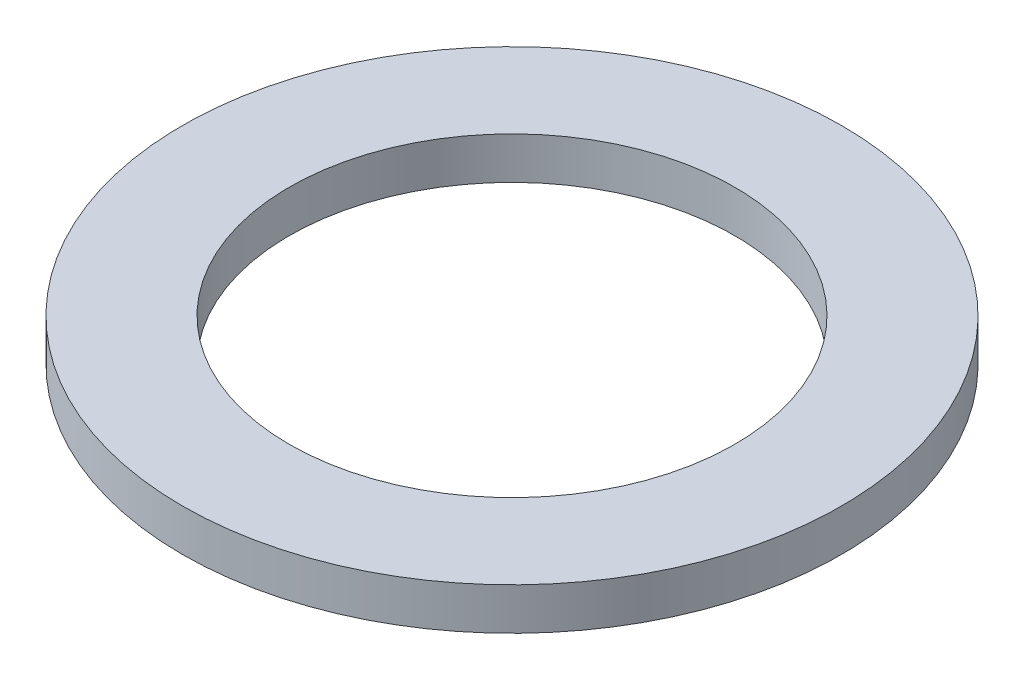
ISO-10303-21;
HEADER;
FILE_DESCRIPTION(('STEP AP214'),'2;1');
FILE_NAME('part.step','',(''),(''),'','','');
FILE_SCHEMA(('AUTOMOTIVE_DESIGN { 1 0 10303 214 1 1 1 1 }'));
ENDSEC;
DATA;
#1=APPLICATION_CONTEXT('core data for automotive mechanical design processes');
#2=APPLICATION_PROTOCOL_DEFINITION('international standard','automotive_design',2000,#1);
#3=PRODUCT_CONTEXT('',#1,'mechanical');
#4=PRODUCT('Part','Part','',(#3));
#5=PRODUCT_RELATED_PRODUCT_CATEGORY('part','',(#4));
#6=PRODUCT_DEFINITION_FORMATION('','',#4);
#7=PRODUCT_DEFINITION_CONTEXT('part definition',#1,'design');
#8=PRODUCT_DEFINITION('design','',#6,#7);
#9=PRODUCT_DEFINITION_SHAPE('','',#8);
#10=(LENGTH_UNIT() NAMED_UNIT(*) SI_UNIT(.MILLI.,.METRE.));
#11=(NAMED_UNIT(*) PLANE_ANGLE_UNIT() SI_UNIT($,.RADIAN.));
#12=(NAMED_UNIT(*) SI_UNIT($,.STERADIAN.) SOLID_ANGLE_UNIT());
#13=UNCERTAINTY_MEASURE_WITH_UNIT(LENGTH_MEASURE(1.E-05),#10,'distance_accuracy_value','');
#14=(GEOMETRIC_REPRESENTATION_CONTEXT(3) GLOBAL_UNCERTAINTY_ASSIGNED_CONTEXT((#13)) GLOBAL_UNIT_ASSIGNED_CONTEXT((#10,
#11,#12)) REPRESENTATION_CONTEXT('',''));
#15=CARTESIAN_POINT('',(0.,0.,0.));
#16=DIRECTION('',(0.,0.,1.));
#17=DIRECTION('',(1.,0.,0.));
#18=AXIS2_PLACEMENT_3D('',#15,#16,#17);
#19=CARTESIAN_POINT('',(0.,5.,0.));
#20=DIRECTION('',(0.,1.,0.));
#21=DIRECTION('',(0.,0.,1.));
#22=AXIS2_PLACEMENT_3D('',#19,#20,#21);
#23=PLANE('',#22);
#24=CARTESIAN_POINT('',(0.,5.,0.));
#25=DIRECTION('',(0.,1.,0.));
#26=DIRECTION('',(0.,0.,1.));
#27=AXIS2_PLACEMENT_3D('',#24,#25,#26);
#28=CIRCLE('',#27,39.22);
#29=CARTESIAN_POINT('',(0.,5.,39.22));
#30=VERTEX_POINT('',#29);
#31=EDGE_CURVE('E10',#30,#30,#28,.T.);
#32=ORIENTED_EDGE('',*,*,#31,.T.);
#33=EDGE_LOOP('',(#32));
#34=FACE_BOUND('',#33,.T.);
#35=CARTESIAN_POINT('',(0.,5.,0.));
#36=DIRECTION('',(0.,1.,0.));
#37=DIRECTION('',(0.,0.,1.));
#38=AXIS2_PLACEMENT_3D('',#35,#36,#37);
#39=CIRCLE('',#38,26.51);
#40=CARTESIAN_POINT('',(0.,5.,26.51));
#41=VERTEX_POINT('',#40);
#42=EDGE_CURVE('E43',#41,#41,#39,.T.);
#43=ORIENTED_EDGE('',*,*,#42,.F.);
#44=EDGE_LOOP('',(#43));
#45=FACE_BOUND('',#44,.T.);
#46=ADVANCED_FACE('F32',(#34,#45),#23,.T.);
#47=CARTESIAN_POINT('',(0.,0.,0.));
#48=DIRECTION('',(0.,1.,0.));
#49=DIRECTION('',(0.,0.,1.));
#50=AXIS2_PLACEMENT_3D('',#47,#48,#49);
#51=PLANE('',#50);
#52=CARTESIAN_POINT('',(0.,0.,0.));
#53=DIRECTION('',(0.,1.,0.));
#54=DIRECTION('',(0.,0.,1.));
#55=AXIS2_PLACEMENT_3D('',#52,#53,#54);
#56=CIRCLE('',#55,39.22);
#57=CARTESIAN_POINT('',(0.,0.,39.22));
#58=VERTEX_POINT('',#57);
#59=EDGE_CURVE('E36',#58,#58,#56,.T.);
#60=ORIENTED_EDGE('',*,*,#59,.F.);
#61=EDGE_LOOP('',(#60));
#62=FACE_BOUND('',#61,.T.);
#63=CARTESIAN_POINT('',(0.,0.,0.));
#64=DIRECTION('',(0.,1.,0.));
#65=DIRECTION('',(0.,0.,1.));
#66=AXIS2_PLACEMENT_3D('',#63,#64,#65);
#67=CIRCLE('',#66,26.51);
#68=CARTESIAN_POINT('',(0.,0.,26.51));
#69=VERTEX_POINT('',#68);
#70=EDGE_CURVE('E45',#69,#69,#67,.T.);
#71=ORIENTED_EDGE('',*,*,#70,.T.);
#72=EDGE_LOOP('',(#71));
#73=FACE_BOUND('',#72,.T.);
#74=ADVANCED_FACE('F55',(#62,#73),#51,.F.);
#75=CARTESIAN_POINT('',(0.,5.,0.));
#76=DIRECTION('',(0.,-1.,0.));
#77=DIRECTION('',(0.,0.,-1.));
#78=AXIS2_PLACEMENT_3D('',#75,#76,#77);
#79=CYLINDRICAL_SURFACE('',#78,39.22);
#80=ORIENTED_EDGE('',*,*,#31,.F.);
#81=EDGE_LOOP('',(#80));
#82=FACE_BOUND('',#81,.T.);
#83=ORIENTED_EDGE('',*,*,#59,.T.);
#84=EDGE_LOOP('',(#83));
#85=FACE_BOUND('',#84,.T.);
#86=ADVANCED_FACE('F34',(#82,#85),#79,.T.);
#87=CARTESIAN_POINT('',(0.,5.,0.));
#88=DIRECTION('',(0.,-1.,0.));
#89=DIRECTION('',(0.,0.,-1.));
#90=AXIS2_PLACEMENT_3D('',#87,#88,#89);
#91=CYLINDRICAL_SURFACE('',#90,26.51);
#92=ORIENTED_EDGE('',*,*,#42,.T.);
#93=EDGE_LOOP('',(#92));
#94=FACE_BOUND('',#93,.T.);
#95=ORIENTED_EDGE('',*,*,#70,.F.);
#96=EDGE_LOOP('',(#95));
#97=FACE_BOUND('',#96,.T.);
#98=ADVANCED_FACE('F51',(#94,#97),#91,.F.);
#99=CLOSED_SHELL('',(#46,#74,#86,#98));
#100=MANIFOLD_SOLID_BREP('B2',#99);
#101=ADVANCED_BREP_SHAPE_REPRESENTATION('',(#18,#100),#14);
#102=SHAPE_DEFINITION_REPRESENTATION(#9,#101);
ENDSEC;
END-ISO-10303-21;
